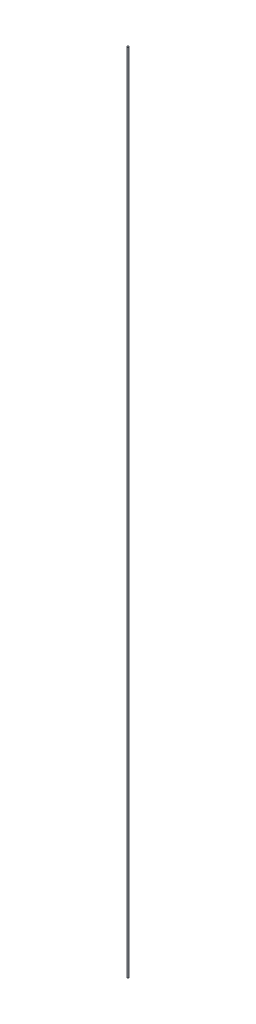
ISO-10303-21;
HEADER;
FILE_DESCRIPTION(('STEP AP214'),'2;1');
FILE_NAME('part.step','',(''),(''),'','','');
FILE_SCHEMA(('AUTOMOTIVE_DESIGN { 1 0 10303 214 1 1 1 1 }'));
ENDSEC;
DATA;
#1=APPLICATION_CONTEXT('core data for automotive mechanical design processes');
#2=APPLICATION_PROTOCOL_DEFINITION('international standard','automotive_design',2000,#1);
#3=PRODUCT_CONTEXT('',#1,'mechanical');
#4=PRODUCT('Part','Part','',(#3));
#5=PRODUCT_RELATED_PRODUCT_CATEGORY('part','',(#4));
#6=PRODUCT_DEFINITION_FORMATION('','',#4);
#7=PRODUCT_DEFINITION_CONTEXT('part definition',#1,'design');
#8=PRODUCT_DEFINITION('design','',#6,#7);
#9=PRODUCT_DEFINITION_SHAPE('','',#8);
#10=(LENGTH_UNIT() NAMED_UNIT(*) SI_UNIT(.MILLI.,.METRE.));
#11=(NAMED_UNIT(*) PLANE_ANGLE_UNIT() SI_UNIT($,.RADIAN.));
#12=(NAMED_UNIT(*) SI_UNIT($,.STERADIAN.) SOLID_ANGLE_UNIT());
#13=UNCERTAINTY_MEASURE_WITH_UNIT(LENGTH_MEASURE(1.E-05),#10,'distance_accuracy_value','');
#14=(GEOMETRIC_REPRESENTATION_CONTEXT(3) GLOBAL_UNCERTAINTY_ASSIGNED_CONTEXT((#13)) GLOBAL_UNIT_ASSIGNED_CONTEXT((#10,
#11,#12)) REPRESENTATION_CONTEXT('',''));
#15=CARTESIAN_POINT('',(0.,0.,0.));
#16=DIRECTION('',(0.,0.,1.));
#17=DIRECTION('',(1.,0.,0.));
#18=AXIS2_PLACEMENT_3D('',#15,#16,#17);
#19=CARTESIAN_POINT('',(0.,580.,0.));
#20=DIRECTION('',(0.,-1.,0.));
#21=DIRECTION('',(0.,0.,-1.));
#22=AXIS2_PLACEMENT_3D('',#19,#20,#21);
#23=CYLINDRICAL_SURFACE('',#22,0.5);
#24=CARTESIAN_POINT('',(0.,0.,0.));
#25=DIRECTION('',(0.,1.,0.));
#26=DIRECTION('',(0.,0.,1.));
#27=AXIS2_PLACEMENT_3D('',#24,#25,#26);
#28=CIRCLE('',#27,0.5);
#29=CARTESIAN_POINT('',(0.,0.,0.5));
#30=VERTEX_POINT('',#29);
#31=EDGE_CURVE('E10',#30,#30,#28,.T.);
#32=ORIENTED_EDGE('',*,*,#31,.T.);
#33=EDGE_LOOP('',(#32));
#34=FACE_BOUND('',#33,.T.);
#35=CARTESIAN_POINT('',(0.,500.,0.));
#36=DIRECTION('',(0.,1.,0.));
#37=DIRECTION('',(0.,0.,1.));
#38=AXIS2_PLACEMENT_3D('',#35,#36,#37);
#39=CIRCLE('',#38,0.5);
#40=CARTESIAN_POINT('',(0.,500.,0.5));
#41=VERTEX_POINT('',#40);
#42=EDGE_CURVE('E37',#41,#41,#39,.T.);
#43=ORIENTED_EDGE('',*,*,#42,.F.);
#44=EDGE_LOOP('',(#43));
#45=FACE_BOUND('',#44,.T.);
#46=ADVANCED_FACE('F31',(#34,#45),#23,.T.);
#47=CARTESIAN_POINT('',(0.,0.,0.));
#48=DIRECTION('',(0.,1.,0.));
#49=DIRECTION('',(0.,0.,1.));
#50=AXIS2_PLACEMENT_3D('',#47,#48,#49);
#51=PLANE('',#50);
#52=ORIENTED_EDGE('',*,*,#31,.F.);
#53=EDGE_LOOP('',(#52));
#54=FACE_BOUND('',#53,.T.);
#55=ADVANCED_FACE('F46',(#54),#51,.F.);
#56=CARTESIAN_POINT('',(0.,500.,0.));
#57=DIRECTION('',(0.,1.,0.));
#58=DIRECTION('',(0.,0.,1.));
#59=AXIS2_PLACEMENT_3D('',#56,#57,#58);
#60=PLANE('',#59);
#61=ORIENTED_EDGE('',*,*,#42,.T.);
#62=EDGE_LOOP('',(#61));
#63=FACE_BOUND('',#62,.T.);
#64=ADVANCED_FACE('F43',(#63),#60,.T.);
#65=CLOSED_SHELL('',(#46,#55,#64));
#66=MANIFOLD_SOLID_BREP('B2',#65);
#67=ADVANCED_BREP_SHAPE_REPRESENTATION('',(#18,#66),#14);
#68=SHAPE_DEFINITION_REPRESENTATION(#9,#67);
ENDSEC;
END-ISO-10303-21;
